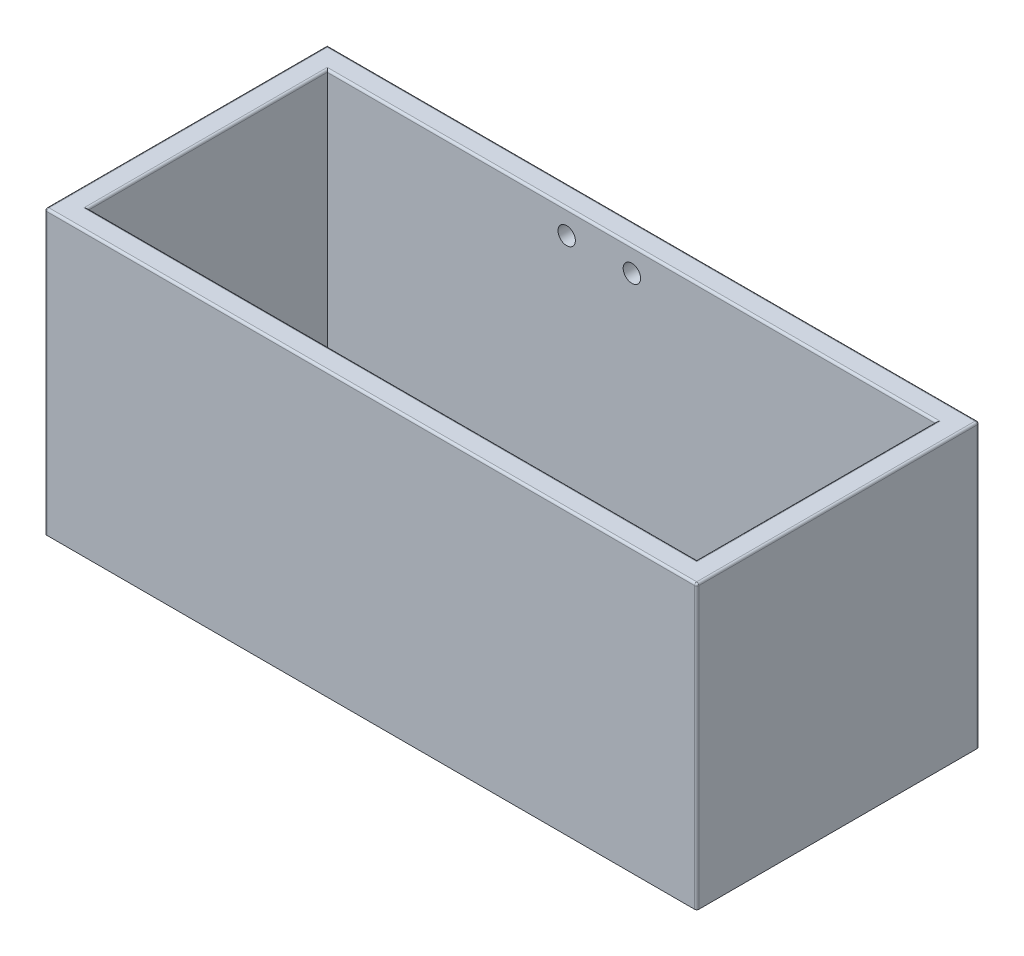
ISO-10303-21;
HEADER;
FILE_DESCRIPTION(('STEP AP214'),'2;1');
FILE_NAME('part.step','',(''),(''),'','','');
FILE_SCHEMA(('AUTOMOTIVE_DESIGN { 1 0 10303 214 1 1 1 1 }'));
ENDSEC;
DATA;
#1=APPLICATION_CONTEXT('core data for automotive mechanical design processes');
#2=APPLICATION_PROTOCOL_DEFINITION('international standard','automotive_design',2000,#1);
#3=PRODUCT_CONTEXT('',#1,'mechanical');
#4=PRODUCT('Part','Part','',(#3));
#5=PRODUCT_RELATED_PRODUCT_CATEGORY('part','',(#4));
#6=PRODUCT_DEFINITION_FORMATION('','',#4);
#7=PRODUCT_DEFINITION_CONTEXT('part definition',#1,'design');
#8=PRODUCT_DEFINITION('design','',#6,#7);
#9=PRODUCT_DEFINITION_SHAPE('','',#8);
#10=(LENGTH_UNIT() NAMED_UNIT(*) SI_UNIT(.MILLI.,.METRE.));
#11=(NAMED_UNIT(*) PLANE_ANGLE_UNIT() SI_UNIT($,.RADIAN.));
#12=(NAMED_UNIT(*) SI_UNIT($,.STERADIAN.) SOLID_ANGLE_UNIT());
#13=UNCERTAINTY_MEASURE_WITH_UNIT(LENGTH_MEASURE(1.E-05),#10,'distance_accuracy_value','');
#14=(GEOMETRIC_REPRESENTATION_CONTEXT(3) GLOBAL_UNCERTAINTY_ASSIGNED_CONTEXT((#13)) GLOBAL_UNIT_ASSIGNED_CONTEXT((#10,
#11,#12)) REPRESENTATION_CONTEXT('',''));
#15=CARTESIAN_POINT('',(0.,0.,0.));
#16=DIRECTION('',(0.,0.,1.));
#17=DIRECTION('',(1.,0.,0.));
#18=AXIS2_PLACEMENT_3D('',#15,#16,#17);
#19=CARTESIAN_POINT('',(-114.282418976587,130.,130.));
#20=DIRECTION('',(1.,0.,0.));
#21=DIRECTION('',(0.,0.,-1.));
#22=AXIS2_PLACEMENT_3D('',#19,#20,#21);
#23=PLANE('',#22);
#24=DIRECTION('',(0.,0.,-1.));
#25=VECTOR('',#24,1.);
#26=CARTESIAN_POINT('',(-114.282418976587,0.,130.));
#27=LINE('',#26,#25);
#28=CARTESIAN_POINT('',(-114.282418976587,0.,129.));
#29=VERTEX_POINT('',#28);
#30=CARTESIAN_POINT('',(-114.282418976587,0.,0.));
#31=VERTEX_POINT('',#30);
#32=EDGE_CURVE('E200',#29,#31,#27,.T.);
#33=ORIENTED_EDGE('',*,*,#32,.F.);
#34=DIRECTION('',(0.,-1.,0.));
#35=VECTOR('',#34,1.);
#36=CARTESIAN_POINT('',(-114.282418976587,129.,129.));
#37=LINE('',#36,#35);
#38=CARTESIAN_POINT('',(-114.282418976587,129.,129.));
#39=VERTEX_POINT('',#38);
#40=EDGE_CURVE('E247',#29,#39,#37,.F.);
#41=ORIENTED_EDGE('',*,*,#40,.T.);
#42=DIRECTION('',(0.,0.,-1.));
#43=VECTOR('',#42,1.);
#44=CARTESIAN_POINT('',(-114.282418976587,129.,130.));
#45=LINE('',#44,#43);
#46=CARTESIAN_POINT('',(-114.282418976587,129.,0.));
#47=VERTEX_POINT('',#46);
#48=EDGE_CURVE('E228',#39,#47,#45,.T.);
#49=ORIENTED_EDGE('',*,*,#48,.T.);
#50=DIRECTION('',(0.,-1.,0.));
#51=VECTOR('',#50,1.);
#52=CARTESIAN_POINT('',(-114.282418976587,130.,0.));
#53=LINE('',#52,#51);
#54=EDGE_CURVE('E184',#47,#31,#53,.T.);
#55=ORIENTED_EDGE('',*,*,#54,.T.);
#56=EDGE_LOOP('',(#33,#41,#49,#55));
#57=FACE_BOUND('',#56,.T.);
#58=ADVANCED_FACE('F37',(#57),#23,.F.);
#59=CARTESIAN_POINT('',(-114.282418976587,0.,130.));
#60=DIRECTION('',(0.,1.,0.));
#61=DIRECTION('',(0.,0.,1.));
#62=AXIS2_PLACEMENT_3D('',#59,#60,#61);
#63=PLANE('',#62);
#64=DIRECTION('',(0.,0.,-1.));
#65=VECTOR('',#64,1.);
#66=CARTESIAN_POINT('',(185.717581023413,0.,130.));
#67=LINE('',#66,#65);
#68=CARTESIAN_POINT('',(185.717581023413,0.,129.));
#69=VERTEX_POINT('',#68);
#70=CARTESIAN_POINT('',(185.717581023413,0.,1.));
#71=VERTEX_POINT('',#70);
#72=EDGE_CURVE('E192',#69,#71,#67,.T.);
#73=ORIENTED_EDGE('',*,*,#72,.F.);
#74=CARTESIAN_POINT('',(184.717581023413,0.,129.));
#75=DIRECTION('',(0.,1.,0.));
#76=DIRECTION('',(0.,0.,1.));
#77=AXIS2_PLACEMENT_3D('',#74,#75,#76);
#78=CIRCLE('',#77,1.);
#79=CARTESIAN_POINT('',(184.717581023413,0.,130.));
#80=VERTEX_POINT('',#79);
#81=EDGE_CURVE('E269',#69,#80,#78,.F.);
#82=ORIENTED_EDGE('',*,*,#81,.T.);
#83=DIRECTION('',(1.,0.,0.));
#84=VECTOR('',#83,1.);
#85=CARTESIAN_POINT('',(-114.282418976587,0.,130.));
#86=LINE('',#85,#84);
#87=CARTESIAN_POINT('',(-113.282418976587,0.,130.));
#88=VERTEX_POINT('',#87);
#89=EDGE_CURVE('E189',#88,#80,#86,.T.);
#90=ORIENTED_EDGE('',*,*,#89,.F.);
#91=CARTESIAN_POINT('',(-113.282418976587,0.,129.));
#92=DIRECTION('',(0.,1.,0.));
#93=DIRECTION('',(0.,0.,1.));
#94=AXIS2_PLACEMENT_3D('',#91,#92,#93);
#95=CIRCLE('',#94,1.);
#96=EDGE_CURVE('E245',#88,#29,#95,.F.);
#97=ORIENTED_EDGE('',*,*,#96,.T.);
#98=ORIENTED_EDGE('',*,*,#32,.T.);
#99=DIRECTION('',(1.,0.,0.));
#100=VECTOR('',#99,1.);
#101=CARTESIAN_POINT('',(-114.282418976587,0.,0.));
#102=LINE('',#101,#100);
#103=CARTESIAN_POINT('',(184.717581023413,0.,0.));
#104=VERTEX_POINT('',#103);
#105=EDGE_CURVE('E193',#31,#104,#102,.T.);
#106=ORIENTED_EDGE('',*,*,#105,.T.);
#107=CARTESIAN_POINT('',(184.717581023413,0.,1.));
#108=DIRECTION('',(0.,1.,0.));
#109=DIRECTION('',(0.,0.,1.));
#110=AXIS2_PLACEMENT_3D('',#107,#108,#109);
#111=CIRCLE('',#110,1.);
#112=EDGE_CURVE('E267',#104,#71,#111,.F.);
#113=ORIENTED_EDGE('',*,*,#112,.T.);
#114=EDGE_LOOP('',(#73,#82,#90,#97,#98,#106,#113));
#115=FACE_BOUND('',#114,.T.);
#116=ADVANCED_FACE('F300',(#115),#63,.F.);
#117=CARTESIAN_POINT('',(185.717581023413,0.,130.));
#118=DIRECTION('',(-1.,0.,0.));
#119=DIRECTION('',(0.,-1.,0.));
#120=AXIS2_PLACEMENT_3D('',#117,#118,#119);
#121=PLANE('',#120);
#122=DIRECTION('',(0.,0.,-1.));
#123=VECTOR('',#122,1.);
#124=CARTESIAN_POINT('',(185.717581023413,129.,130.));
#125=LINE('',#124,#123);
#126=CARTESIAN_POINT('',(185.717581023413,129.,1.));
#127=VERTEX_POINT('',#126);
#128=CARTESIAN_POINT('',(185.717581023413,129.,129.));
#129=VERTEX_POINT('',#128);
#130=EDGE_CURVE('E261',#127,#129,#125,.F.);
#131=ORIENTED_EDGE('',*,*,#130,.T.);
#132=DIRECTION('',(0.,1.,0.));
#133=VECTOR('',#132,1.);
#134=CARTESIAN_POINT('',(185.717581023413,0.,129.));
#135=LINE('',#134,#133);
#136=EDGE_CURVE('E265',#129,#69,#135,.F.);
#137=ORIENTED_EDGE('',*,*,#136,.T.);
#138=ORIENTED_EDGE('',*,*,#72,.T.);
#139=DIRECTION('',(0.,1.,0.));
#140=VECTOR('',#139,1.);
#141=CARTESIAN_POINT('',(185.717581023413,0.,1.));
#142=LINE('',#141,#140);
#143=EDGE_CURVE('E263',#71,#127,#142,.T.);
#144=ORIENTED_EDGE('',*,*,#143,.T.);
#145=EDGE_LOOP('',(#131,#137,#138,#144));
#146=FACE_BOUND('',#145,.T.);
#147=ADVANCED_FACE('F330',(#146),#121,.F.);
#148=CARTESIAN_POINT('',(185.717581023413,130.,130.));
#149=DIRECTION('',(0.,-1.,0.));
#150=DIRECTION('',(1.,0.,0.));
#151=AXIS2_PLACEMENT_3D('',#148,#149,#150);
#152=PLANE('',#151);
#153=DIRECTION('',(-1.,0.,0.));
#154=VECTOR('',#153,1.);
#155=CARTESIAN_POINT('',(185.717581023413,130.,9.00000000000001));
#156=LINE('',#155,#154);
#157=CARTESIAN_POINT('',(-105.282418976587,130.,9.));
#158=VERTEX_POINT('',#157);
#159=CARTESIAN_POINT('',(176.717581023413,130.,9.00000000000001));
#160=VERTEX_POINT('',#159);
#161=EDGE_CURVE('E207',#158,#160,#156,.F.);
#162=ORIENTED_EDGE('',*,*,#161,.T.);
#163=DIRECTION('',(0.,0.,-1.));
#164=VECTOR('',#163,1.);
#165=CARTESIAN_POINT('',(176.717581023413,130.,130.));
#166=LINE('',#165,#164);
#167=CARTESIAN_POINT('',(176.717581023413,130.,121.));
#168=VERTEX_POINT('',#167);
#169=EDGE_CURVE('E220',#160,#168,#166,.F.);
#170=ORIENTED_EDGE('',*,*,#169,.T.);
#171=DIRECTION('',(1.,0.,0.));
#172=VECTOR('',#171,1.);
#173=CARTESIAN_POINT('',(185.717581023413,130.,121.));
#174=LINE('',#173,#172);
#175=CARTESIAN_POINT('',(-105.282418976587,130.,121.));
#176=VERTEX_POINT('',#175);
#177=EDGE_CURVE('E212',#168,#176,#174,.F.);
#178=ORIENTED_EDGE('',*,*,#177,.T.);
#179=DIRECTION('',(0.,0.,1.));
#180=VECTOR('',#179,1.);
#181=CARTESIAN_POINT('',(-105.282418976587,130.,130.));
#182=LINE('',#181,#180);
#183=EDGE_CURVE('E205',#176,#158,#182,.F.);
#184=ORIENTED_EDGE('',*,*,#183,.T.);
#185=EDGE_LOOP('',(#162,#170,#178,#184));
#186=FACE_BOUND('',#185,.T.);
#187=DIRECTION('',(-1.,0.,0.));
#188=VECTOR('',#187,1.);
#189=CARTESIAN_POINT('',(185.717581023413,130.,129.));
#190=LINE('',#189,#188);
#191=CARTESIAN_POINT('',(-113.282418976587,130.,129.));
#192=VERTEX_POINT('',#191);
#193=CARTESIAN_POINT('',(184.717581023413,130.,129.));
#194=VERTEX_POINT('',#193);
#195=EDGE_CURVE('E251',#192,#194,#190,.F.);
#196=ORIENTED_EDGE('',*,*,#195,.T.);
#197=DIRECTION('',(0.,0.,-1.));
#198=VECTOR('',#197,1.);
#199=CARTESIAN_POINT('',(184.717581023413,130.,130.));
#200=LINE('',#199,#198);
#201=CARTESIAN_POINT('',(184.717581023413,130.,1.));
#202=VERTEX_POINT('',#201);
#203=EDGE_CURVE('E11',#194,#202,#200,.T.);
#204=ORIENTED_EDGE('',*,*,#203,.T.);
#205=DIRECTION('',(-1.,0.,0.));
#206=VECTOR('',#205,1.);
#207=CARTESIAN_POINT('',(185.717581023413,130.,1.));
#208=LINE('',#207,#206);
#209=CARTESIAN_POINT('',(-113.282418976587,130.,1.));
#210=VERTEX_POINT('',#209);
#211=EDGE_CURVE('E230',#202,#210,#208,.T.);
#212=ORIENTED_EDGE('',*,*,#211,.T.);
#213=DIRECTION('',(0.,0.,-1.));
#214=VECTOR('',#213,1.);
#215=CARTESIAN_POINT('',(-113.282418976587,130.,130.));
#216=LINE('',#215,#214);
#217=EDGE_CURVE('E232',#210,#192,#216,.F.);
#218=ORIENTED_EDGE('',*,*,#217,.T.);
#219=EDGE_LOOP('',(#196,#204,#212,#218));
#220=FACE_BOUND('',#219,.T.);
#221=ADVANCED_FACE('F350',(#186,#220),#152,.F.);
#222=CARTESIAN_POINT('',(0.,0.,130.));
#223=DIRECTION('',(0.,0.,1.));
#224=DIRECTION('',(1.,0.,0.));
#225=AXIS2_PLACEMENT_3D('',#222,#223,#224);
#226=PLANE('',#225);
#227=ORIENTED_EDGE('',*,*,#89,.T.);
#228=DIRECTION('',(0.,1.,0.));
#229=VECTOR('',#228,1.);
#230=CARTESIAN_POINT('',(184.717581023413,129.,130.));
#231=LINE('',#230,#229);
#232=CARTESIAN_POINT('',(184.717581023413,129.,130.));
#233=VERTEX_POINT('',#232);
#234=EDGE_CURVE('E253',#80,#233,#231,.T.);
#235=ORIENTED_EDGE('',*,*,#234,.T.);
#236=DIRECTION('',(-1.,0.,0.));
#237=VECTOR('',#236,1.);
#238=CARTESIAN_POINT('',(-113.282418976587,129.,130.));
#239=LINE('',#238,#237);
#240=CARTESIAN_POINT('',(-113.282418976587,129.,130.));
#241=VERTEX_POINT('',#240);
#242=EDGE_CURVE('E237',#233,#241,#239,.T.);
#243=ORIENTED_EDGE('',*,*,#242,.T.);
#244=DIRECTION('',(0.,-1.,0.));
#245=VECTOR('',#244,1.);
#246=CARTESIAN_POINT('',(-113.282418976587,0.,130.));
#247=LINE('',#246,#245);
#248=EDGE_CURVE('E242',#241,#88,#247,.T.);
#249=ORIENTED_EDGE('',*,*,#248,.T.);
#250=EDGE_LOOP('',(#227,#235,#243,#249));
#251=FACE_BOUND('',#250,.T.);
#252=ADVANCED_FACE('F375',(#251),#226,.T.);
#253=CARTESIAN_POINT('',(0.,0.,0.));
#254=DIRECTION('',(0.,0.,1.));
#255=DIRECTION('',(1.,0.,0.));
#256=AXIS2_PLACEMENT_3D('',#253,#254,#255);
#257=PLANE('',#256);
#258=CARTESIAN_POINT('',(35.8724753435465,119.001199684483,0.));
#259=DIRECTION('',(0.,0.,1.));
#260=DIRECTION('',(1.,0.,0.));
#261=AXIS2_PLACEMENT_3D('',#258,#259,#260);
#262=CIRCLE('',#261,4.00000000000001);
#263=CARTESIAN_POINT('',(39.8724753435465,119.001199684483,0.));
#264=VERTEX_POINT('',#263);
#265=EDGE_CURVE('E590',#264,#264,#262,.T.);
#266=ORIENTED_EDGE('',*,*,#265,.T.);
#267=EDGE_LOOP('',(#266));
#268=FACE_BOUND('',#267,.T.);
#269=CARTESIAN_POINT('',(5.87247536753392,119.,0.));
#270=DIRECTION('',(0.,0.,1.));
#271=DIRECTION('',(1.,0.,0.));
#272=AXIS2_PLACEMENT_3D('',#269,#270,#271);
#273=CIRCLE('',#272,4.);
#274=CARTESIAN_POINT('',(9.87247536753392,119.,0.));
#275=VERTEX_POINT('',#274);
#276=EDGE_CURVE('E279',#275,#275,#273,.T.);
#277=ORIENTED_EDGE('',*,*,#276,.T.);
#278=EDGE_LOOP('',(#277));
#279=FACE_BOUND('',#278,.T.);
#280=DIRECTION('',(-1.,0.,0.));
#281=VECTOR('',#280,1.);
#282=CARTESIAN_POINT('',(0.,129.,0.));
#283=LINE('',#282,#281);
#284=CARTESIAN_POINT('',(184.717581023413,129.,0.));
#285=VERTEX_POINT('',#284);
#286=EDGE_CURVE('E235',#47,#285,#283,.F.);
#287=ORIENTED_EDGE('',*,*,#286,.T.);
#288=DIRECTION('',(0.,1.,0.));
#289=VECTOR('',#288,1.);
#290=CARTESIAN_POINT('',(184.717581023413,0.,0.));
#291=LINE('',#290,#289);
#292=EDGE_CURVE('E273',#285,#104,#291,.F.);
#293=ORIENTED_EDGE('',*,*,#292,.T.);
#294=ORIENTED_EDGE('',*,*,#105,.F.);
#295=ORIENTED_EDGE('',*,*,#54,.F.);
#296=EDGE_LOOP('',(#287,#293,#294,#295));
#297=FACE_BOUND('',#296,.T.);
#298=ADVANCED_FACE('F296',(#268,#279,#297),#257,.F.);
#299=CARTESIAN_POINT('',(-104.282418976587,10.,10.));
#300=DIRECTION('',(-1.,0.,0.));
#301=DIRECTION('',(0.,-1.,0.));
#302=AXIS2_PLACEMENT_3D('',#299,#300,#301);
#303=PLANE('',#302);
#304=DIRECTION('',(0.,1.,0.));
#305=VECTOR('',#304,1.);
#306=CARTESIAN_POINT('',(-104.282418976587,10.,10.));
#307=LINE('',#306,#305);
#308=CARTESIAN_POINT('',(-104.282418976587,10.,10.));
#309=VERTEX_POINT('',#308);
#310=CARTESIAN_POINT('',(-104.282418976587,129.,10.));
#311=VERTEX_POINT('',#310);
#312=EDGE_CURVE('E182',#309,#311,#307,.T.);
#313=ORIENTED_EDGE('',*,*,#312,.T.);
#314=DIRECTION('',(0.,0.,1.));
#315=VECTOR('',#314,1.);
#316=CARTESIAN_POINT('',(-104.282418976587,129.,10.));
#317=LINE('',#316,#315);
#318=CARTESIAN_POINT('',(-104.282418976587,129.,120.));
#319=VERTEX_POINT('',#318);
#320=EDGE_CURVE('E154',#311,#319,#317,.T.);
#321=ORIENTED_EDGE('',*,*,#320,.T.);
#322=DIRECTION('',(0.,1.,0.));
#323=VECTOR('',#322,1.);
#324=CARTESIAN_POINT('',(-104.282418976587,10.,120.));
#325=LINE('',#324,#323);
#326=CARTESIAN_POINT('',(-104.282418976587,10.,120.));
#327=VERTEX_POINT('',#326);
#328=EDGE_CURVE('E146',#327,#319,#325,.T.);
#329=ORIENTED_EDGE('',*,*,#328,.F.);
#330=DIRECTION('',(0.,0.,1.));
#331=VECTOR('',#330,1.);
#332=CARTESIAN_POINT('',(-104.282418976587,10.,10.));
#333=LINE('',#332,#331);
#334=EDGE_CURVE('E151',#309,#327,#333,.T.);
#335=ORIENTED_EDGE('',*,*,#334,.F.);
#336=EDGE_LOOP('',(#313,#321,#329,#335));
#337=FACE_BOUND('',#336,.T.);
#338=ADVANCED_FACE('F149',(#337),#303,.F.);
#339=CARTESIAN_POINT('',(-104.282418976587,10.,10.));
#340=DIRECTION('',(0.,0.,-1.));
#341=DIRECTION('',(-1.,0.,0.));
#342=AXIS2_PLACEMENT_3D('',#339,#340,#341);
#343=PLANE('',#342);
#344=CARTESIAN_POINT('',(35.8724753435465,119.001199684483,10.));
#345=DIRECTION('',(0.,0.,1.));
#346=DIRECTION('',(1.,0.,0.));
#347=AXIS2_PLACEMENT_3D('',#344,#345,#346);
#348=CIRCLE('',#347,4.00000000000001);
#349=CARTESIAN_POINT('',(39.8724753435465,119.001199684483,10.));
#350=VERTEX_POINT('',#349);
#351=EDGE_CURVE('E592',#350,#350,#348,.T.);
#352=ORIENTED_EDGE('',*,*,#351,.F.);
#353=EDGE_LOOP('',(#352));
#354=FACE_BOUND('',#353,.T.);
#355=CARTESIAN_POINT('',(5.87247536753392,119.,10.));
#356=DIRECTION('',(0.,0.,1.));
#357=DIRECTION('',(1.,0.,0.));
#358=AXIS2_PLACEMENT_3D('',#355,#356,#357);
#359=CIRCLE('',#358,4.);
#360=CARTESIAN_POINT('',(9.87247536753392,119.,10.));
#361=VERTEX_POINT('',#360);
#362=EDGE_CURVE('E177',#361,#361,#359,.T.);
#363=ORIENTED_EDGE('',*,*,#362,.F.);
#364=EDGE_LOOP('',(#363));
#365=FACE_BOUND('',#364,.T.);
#366=DIRECTION('',(0.,1.,0.));
#367=VECTOR('',#366,1.);
#368=CARTESIAN_POINT('',(175.717581023413,10.0000000000001,10.));
#369=LINE('',#368,#367);
#370=CARTESIAN_POINT('',(175.717581023413,10.0000000000001,10.));
#371=VERTEX_POINT('',#370);
#372=CARTESIAN_POINT('',(175.717581023413,129.,10.));
#373=VERTEX_POINT('',#372);
#374=EDGE_CURVE('E185',#371,#373,#369,.T.);
#375=ORIENTED_EDGE('',*,*,#374,.T.);
#376=DIRECTION('',(-1.,0.,0.));
#377=VECTOR('',#376,1.);
#378=CARTESIAN_POINT('',(-104.282418976587,129.,10.));
#379=LINE('',#378,#377);
#380=EDGE_CURVE('E202',#373,#311,#379,.T.);
#381=ORIENTED_EDGE('',*,*,#380,.T.);
#382=ORIENTED_EDGE('',*,*,#312,.F.);
#383=DIRECTION('',(-1.,0.,0.));
#384=VECTOR('',#383,1.);
#385=CARTESIAN_POINT('',(-104.282418976587,10.,10.));
#386=LINE('',#385,#384);
#387=EDGE_CURVE('E159',#371,#309,#386,.T.);
#388=ORIENTED_EDGE('',*,*,#387,.F.);
#389=EDGE_LOOP('',(#375,#381,#382,#388));
#390=FACE_BOUND('',#389,.T.);
#391=ADVANCED_FACE('F357',(#354,#365,#390),#343,.F.);
#392=CARTESIAN_POINT('',(175.717581023413,10.0000000000001,10.));
#393=DIRECTION('',(1.,0.,0.));
#394=DIRECTION('',(0.,0.,-1.));
#395=AXIS2_PLACEMENT_3D('',#392,#393,#394);
#396=PLANE('',#395);
#397=DIRECTION('',(0.,1.,0.));
#398=VECTOR('',#397,1.);
#399=CARTESIAN_POINT('',(175.717581023413,10.0000000000001,120.));
#400=LINE('',#399,#398);
#401=CARTESIAN_POINT('',(175.717581023413,10.0000000000001,120.));
#402=VERTEX_POINT('',#401);
#403=CARTESIAN_POINT('',(175.717581023413,129.,120.));
#404=VERTEX_POINT('',#403);
#405=EDGE_CURVE('E158',#402,#404,#400,.T.);
#406=ORIENTED_EDGE('',*,*,#405,.T.);
#407=DIRECTION('',(0.,0.,-1.));
#408=VECTOR('',#407,1.);
#409=CARTESIAN_POINT('',(175.717581023413,129.,10.));
#410=LINE('',#409,#408);
#411=EDGE_CURVE('E217',#404,#373,#410,.T.);
#412=ORIENTED_EDGE('',*,*,#411,.T.);
#413=ORIENTED_EDGE('',*,*,#374,.F.);
#414=DIRECTION('',(0.,0.,-1.));
#415=VECTOR('',#414,1.);
#416=CARTESIAN_POINT('',(175.717581023413,10.0000000000001,10.));
#417=LINE('',#416,#415);
#418=EDGE_CURVE('E168',#402,#371,#417,.T.);
#419=ORIENTED_EDGE('',*,*,#418,.F.);
#420=EDGE_LOOP('',(#406,#412,#413,#419));
#421=FACE_BOUND('',#420,.T.);
#422=ADVANCED_FACE('F355',(#421),#396,.F.);
#423=CARTESIAN_POINT('',(-104.282418976587,10.,120.));
#424=DIRECTION('',(0.,0.,1.));
#425=DIRECTION('',(1.,0.,0.));
#426=AXIS2_PLACEMENT_3D('',#423,#424,#425);
#427=PLANE('',#426);
#428=ORIENTED_EDGE('',*,*,#328,.T.);
#429=DIRECTION('',(1.,0.,0.));
#430=VECTOR('',#429,1.);
#431=CARTESIAN_POINT('',(-104.282418976587,129.,120.));
#432=LINE('',#431,#430);
#433=EDGE_CURVE('E209',#319,#404,#432,.T.);
#434=ORIENTED_EDGE('',*,*,#433,.T.);
#435=ORIENTED_EDGE('',*,*,#405,.F.);
#436=DIRECTION('',(1.,0.,0.));
#437=VECTOR('',#436,1.);
#438=CARTESIAN_POINT('',(-104.282418976587,10.,120.));
#439=LINE('',#438,#437);
#440=EDGE_CURVE('E162',#327,#402,#439,.T.);
#441=ORIENTED_EDGE('',*,*,#440,.F.);
#442=EDGE_LOOP('',(#428,#434,#435,#441));
#443=FACE_BOUND('',#442,.T.);
#444=ADVANCED_FACE('F163',(#443),#427,.F.);
#445=CARTESIAN_POINT('',(0.,10.,0.));
#446=DIRECTION('',(0.,1.,0.));
#447=DIRECTION('',(-1.,0.,0.));
#448=AXIS2_PLACEMENT_3D('',#445,#446,#447);
#449=PLANE('',#448);
#450=ORIENTED_EDGE('',*,*,#334,.T.);
#451=ORIENTED_EDGE('',*,*,#440,.T.);
#452=ORIENTED_EDGE('',*,*,#418,.T.);
#453=ORIENTED_EDGE('',*,*,#387,.T.);
#454=EDGE_LOOP('',(#450,#451,#452,#453));
#455=FACE_BOUND('',#454,.T.);
#456=ADVANCED_FACE('F170',(#455),#449,.T.);
#457=CARTESIAN_POINT('',(-105.282418976587,129.,10.));
#458=DIRECTION('',(0.,0.,1.));
#459=DIRECTION('',(1.,0.,0.));
#460=AXIS2_PLACEMENT_3D('',#457,#458,#459);
#461=CYLINDRICAL_SURFACE('',#460,1.);
#462=ORIENTED_EDGE('',*,*,#183,.F.);
#463=CARTESIAN_POINT('',(-105.282418976587,129.,121.));
#464=DIRECTION('',(0.707106781186548,0.,0.707106781186547));
#465=DIRECTION('',(0.707106781186547,0.,-0.707106781186548));
#466=AXIS2_PLACEMENT_3D('',#463,#464,#465);
#467=ELLIPSE('',#466,1.41421356237309,1.);
#468=EDGE_CURVE('E215',#176,#319,#467,.F.);
#469=ORIENTED_EDGE('',*,*,#468,.T.);
#470=ORIENTED_EDGE('',*,*,#320,.F.);
#471=CARTESIAN_POINT('',(-105.282418976587,129.,9.));
#472=DIRECTION('',(-0.707106781186547,0.,0.707106781186548));
#473=DIRECTION('',(-0.707106781186548,0.,-0.707106781186547));
#474=AXIS2_PLACEMENT_3D('',#471,#472,#473);
#475=ELLIPSE('',#474,1.4142135623731,1.);
#476=EDGE_CURVE('E172',#158,#311,#475,.F.);
#477=ORIENTED_EDGE('',*,*,#476,.F.);
#478=EDGE_LOOP('',(#462,#469,#470,#477));
#479=FACE_BOUND('',#478,.T.);
#480=ADVANCED_FACE('F337',(#479),#461,.T.);
#481=CARTESIAN_POINT('',(-104.282418976587,129.,9.));
#482=DIRECTION('',(-1.,0.,0.));
#483=DIRECTION('',(0.,-1.,0.));
#484=AXIS2_PLACEMENT_3D('',#481,#482,#483);
#485=CYLINDRICAL_SURFACE('',#484,1.);
#486=ORIENTED_EDGE('',*,*,#380,.F.);
#487=CARTESIAN_POINT('',(176.717581023413,129.,9.));
#488=DIRECTION('',(-0.707106781186548,0.,-0.707106781186547));
#489=DIRECTION('',(0.707106781186547,0.,-0.707106781186548));
#490=AXIS2_PLACEMENT_3D('',#487,#488,#489);
#491=ELLIPSE('',#490,1.41421356237309,1.);
#492=EDGE_CURVE('E223',#373,#160,#491,.T.);
#493=ORIENTED_EDGE('',*,*,#492,.T.);
#494=ORIENTED_EDGE('',*,*,#161,.F.);
#495=ORIENTED_EDGE('',*,*,#476,.T.);
#496=EDGE_LOOP('',(#486,#493,#494,#495));
#497=FACE_BOUND('',#496,.T.);
#498=ADVANCED_FACE('F334',(#497),#485,.T.);
#499=CARTESIAN_POINT('',(-104.282418976587,129.,121.));
#500=DIRECTION('',(1.,0.,0.));
#501=DIRECTION('',(0.,1.,0.));
#502=AXIS2_PLACEMENT_3D('',#499,#500,#501);
#503=CYLINDRICAL_SURFACE('',#502,1.);
#504=ORIENTED_EDGE('',*,*,#468,.F.);
#505=ORIENTED_EDGE('',*,*,#177,.F.);
#506=CARTESIAN_POINT('',(176.717581023413,129.,121.));
#507=DIRECTION('',(0.707106781186547,0.,-0.707106781186548));
#508=DIRECTION('',(-0.707106781186548,0.,-0.707106781186547));
#509=AXIS2_PLACEMENT_3D('',#506,#507,#508);
#510=ELLIPSE('',#509,1.4142135623731,1.);
#511=EDGE_CURVE('E226',#168,#404,#510,.F.);
#512=ORIENTED_EDGE('',*,*,#511,.T.);
#513=ORIENTED_EDGE('',*,*,#433,.F.);
#514=EDGE_LOOP('',(#504,#505,#512,#513));
#515=FACE_BOUND('',#514,.T.);
#516=ADVANCED_FACE('F321',(#515),#503,.T.);
#517=CARTESIAN_POINT('',(176.717581023413,129.,10.));
#518=DIRECTION('',(0.,0.,-1.));
#519=DIRECTION('',(-1.,0.,0.));
#520=AXIS2_PLACEMENT_3D('',#517,#518,#519);
#521=CYLINDRICAL_SURFACE('',#520,1.);
#522=ORIENTED_EDGE('',*,*,#511,.F.);
#523=ORIENTED_EDGE('',*,*,#169,.F.);
#524=ORIENTED_EDGE('',*,*,#492,.F.);
#525=ORIENTED_EDGE('',*,*,#411,.F.);
#526=EDGE_LOOP('',(#522,#523,#524,#525));
#527=FACE_BOUND('',#526,.T.);
#528=ADVANCED_FACE('F313',(#527),#521,.T.);
#529=CARTESIAN_POINT('',(185.717581023413,129.,1.));
#530=DIRECTION('',(-1.,0.,0.));
#531=DIRECTION('',(0.,-1.,0.));
#532=AXIS2_PLACEMENT_3D('',#529,#530,#531);
#533=CYLINDRICAL_SURFACE('',#532,1.);
#534=ORIENTED_EDGE('',*,*,#211,.F.);
#535=CARTESIAN_POINT('',(184.717581023413,129.,1.));
#536=DIRECTION('',(-1.,0.,0.));
#537=DIRECTION('',(0.,-1.,0.));
#538=AXIS2_PLACEMENT_3D('',#535,#536,#537);
#539=CIRCLE('',#538,1.);
#540=EDGE_CURVE('E46',#202,#285,#539,.T.);
#541=ORIENTED_EDGE('',*,*,#540,.T.);
#542=ORIENTED_EDGE('',*,*,#286,.F.);
#543=CARTESIAN_POINT('',(-113.282418976587,129.,1.));
#544=DIRECTION('',(-0.707106781186547,0.,0.707106781186547));
#545=DIRECTION('',(-0.707106781186547,0.,-0.707106781186547));
#546=AXIS2_PLACEMENT_3D('',#543,#544,#545);
#547=ELLIPSE('',#546,1.41421356237309,1.);
#548=EDGE_CURVE('E174',#210,#47,#547,.T.);
#549=ORIENTED_EDGE('',*,*,#548,.F.);
#550=EDGE_LOOP('',(#534,#541,#542,#549));
#551=FACE_BOUND('',#550,.T.);
#552=ADVANCED_FACE('F311',(#551),#533,.T.);
#553=CARTESIAN_POINT('',(-113.282418976587,129.,130.));
#554=DIRECTION('',(0.,0.,-1.));
#555=DIRECTION('',(-1.,0.,0.));
#556=AXIS2_PLACEMENT_3D('',#553,#554,#555);
#557=CYLINDRICAL_SURFACE('',#556,1.);
#558=ORIENTED_EDGE('',*,*,#48,.F.);
#559=CARTESIAN_POINT('',(-113.282418976587,129.,129.));
#560=DIRECTION('',(0.,0.,-1.));
#561=DIRECTION('',(-1.,0.,0.));
#562=AXIS2_PLACEMENT_3D('',#559,#560,#561);
#563=CIRCLE('',#562,1.);
#564=EDGE_CURVE('E249',#39,#192,#563,.T.);
#565=ORIENTED_EDGE('',*,*,#564,.T.);
#566=ORIENTED_EDGE('',*,*,#217,.F.);
#567=ORIENTED_EDGE('',*,*,#548,.T.);
#568=EDGE_LOOP('',(#558,#565,#566,#567));
#569=FACE_BOUND('',#568,.T.);
#570=ADVANCED_FACE('F310',(#569),#557,.T.);
#571=CARTESIAN_POINT('',(0.,129.,129.));
#572=DIRECTION('',(1.,0.,0.));
#573=DIRECTION('',(0.,1.,0.));
#574=AXIS2_PLACEMENT_3D('',#571,#572,#573);
#575=CYLINDRICAL_SURFACE('',#574,1.);
#576=ORIENTED_EDGE('',*,*,#242,.F.);
#577=CARTESIAN_POINT('',(184.717581023413,129.,129.));
#578=DIRECTION('',(1.,0.,0.));
#579=DIRECTION('',(0.,1.,0.));
#580=AXIS2_PLACEMENT_3D('',#577,#578,#579);
#581=CIRCLE('',#580,1.);
#582=EDGE_CURVE('E271',#233,#194,#581,.F.);
#583=ORIENTED_EDGE('',*,*,#582,.T.);
#584=ORIENTED_EDGE('',*,*,#195,.F.);
#585=CARTESIAN_POINT('',(-113.282418976587,129.,129.));
#586=DIRECTION('',(-1.,0.,0.));
#587=DIRECTION('',(0.,0.,1.));
#588=AXIS2_PLACEMENT_3D('',#585,#586,#587);
#589=CIRCLE('',#588,1.);
#590=EDGE_CURVE('E240',#241,#192,#589,.T.);
#591=ORIENTED_EDGE('',*,*,#590,.F.);
#592=EDGE_LOOP('',(#576,#583,#584,#591));
#593=FACE_BOUND('',#592,.T.);
#594=ADVANCED_FACE('F319',(#593),#575,.T.);
#595=CARTESIAN_POINT('',(-113.282418976587,129.,129.));
#596=DIRECTION('',(0.,0.,1.));
#597=DIRECTION('',(1.,0.,0.));
#598=AXIS2_PLACEMENT_3D('',#595,#596,#597);
#599=SPHERICAL_SURFACE('',#598,1.);
#600=ORIENTED_EDGE('',*,*,#590,.T.);
#601=ORIENTED_EDGE('',*,*,#564,.F.);
#602=CARTESIAN_POINT('',(-113.282418976587,129.,129.));
#603=DIRECTION('',(0.,-1.,0.));
#604=DIRECTION('',(0.,0.,-1.));
#605=AXIS2_PLACEMENT_3D('',#602,#603,#604);
#606=CIRCLE('',#605,1.);
#607=EDGE_CURVE('E254',#241,#39,#606,.T.);
#608=ORIENTED_EDGE('',*,*,#607,.F.);
#609=EDGE_LOOP('',(#600,#601,#608));
#610=FACE_BOUND('',#609,.T.);
#611=ADVANCED_FACE('F405',(#610),#599,.T.);
#612=CARTESIAN_POINT('',(-113.282418976587,0.,129.));
#613=DIRECTION('',(0.,1.,0.));
#614=DIRECTION('',(0.,0.,1.));
#615=AXIS2_PLACEMENT_3D('',#612,#613,#614);
#616=CYLINDRICAL_SURFACE('',#615,1.);
#617=ORIENTED_EDGE('',*,*,#607,.T.);
#618=ORIENTED_EDGE('',*,*,#40,.F.);
#619=ORIENTED_EDGE('',*,*,#96,.F.);
#620=ORIENTED_EDGE('',*,*,#248,.F.);
#621=EDGE_LOOP('',(#617,#618,#619,#620));
#622=FACE_BOUND('',#621,.T.);
#623=ADVANCED_FACE('F407',(#622),#616,.T.);
#624=CARTESIAN_POINT('',(184.717581023413,0.,1.));
#625=DIRECTION('',(0.,1.,0.));
#626=DIRECTION('',(-1.,0.,0.));
#627=AXIS2_PLACEMENT_3D('',#624,#625,#626);
#628=CYLINDRICAL_SURFACE('',#627,1.);
#629=ORIENTED_EDGE('',*,*,#112,.F.);
#630=ORIENTED_EDGE('',*,*,#292,.F.);
#631=CARTESIAN_POINT('',(184.717581023413,129.,1.));
#632=DIRECTION('',(0.,1.,0.));
#633=DIRECTION('',(0.,0.,1.));
#634=AXIS2_PLACEMENT_3D('',#631,#632,#633);
#635=CIRCLE('',#634,1.);
#636=EDGE_CURVE('E41',#127,#285,#635,.T.);
#637=ORIENTED_EDGE('',*,*,#636,.F.);
#638=ORIENTED_EDGE('',*,*,#143,.F.);
#639=EDGE_LOOP('',(#629,#630,#637,#638));
#640=FACE_BOUND('',#639,.T.);
#641=ADVANCED_FACE('F39',(#640),#628,.T.);
#642=CARTESIAN_POINT('',(184.717581023413,129.,1.));
#643=DIRECTION('',(-1.,0.,0.));
#644=DIRECTION('',(0.,-1.,0.));
#645=AXIS2_PLACEMENT_3D('',#642,#643,#644);
#646=SPHERICAL_SURFACE('',#645,1.);
#647=ORIENTED_EDGE('',*,*,#636,.T.);
#648=ORIENTED_EDGE('',*,*,#540,.F.);
#649=CARTESIAN_POINT('',(184.717581023413,129.,1.));
#650=DIRECTION('',(0.,0.,1.));
#651=DIRECTION('',(1.,0.,0.));
#652=AXIS2_PLACEMENT_3D('',#649,#650,#651);
#653=CIRCLE('',#652,1.);
#654=EDGE_CURVE('E281',#127,#202,#653,.T.);
#655=ORIENTED_EDGE('',*,*,#654,.F.);
#656=EDGE_LOOP('',(#647,#648,#655));
#657=FACE_BOUND('',#656,.T.);
#658=ADVANCED_FACE('F289',(#657),#646,.T.);
#659=CARTESIAN_POINT('',(184.717581023413,129.,130.));
#660=DIRECTION('',(0.,0.,-1.));
#661=DIRECTION('',(-1.,0.,0.));
#662=AXIS2_PLACEMENT_3D('',#659,#660,#661);
#663=CYLINDRICAL_SURFACE('',#662,1.);
#664=ORIENTED_EDGE('',*,*,#654,.T.);
#665=ORIENTED_EDGE('',*,*,#203,.F.);
#666=CARTESIAN_POINT('',(184.717581023413,129.,129.));
#667=DIRECTION('',(0.,0.,1.));
#668=DIRECTION('',(1.,0.,0.));
#669=AXIS2_PLACEMENT_3D('',#666,#667,#668);
#670=CIRCLE('',#669,1.);
#671=EDGE_CURVE('E278',#129,#194,#670,.T.);
#672=ORIENTED_EDGE('',*,*,#671,.F.);
#673=ORIENTED_EDGE('',*,*,#130,.F.);
#674=EDGE_LOOP('',(#664,#665,#672,#673));
#675=FACE_BOUND('',#674,.T.);
#676=ADVANCED_FACE('F389',(#675),#663,.T.);
#677=CARTESIAN_POINT('',(184.717581023413,129.,129.));
#678=DIRECTION('',(-1.,0.,0.));
#679=DIRECTION('',(0.,-1.,0.));
#680=AXIS2_PLACEMENT_3D('',#677,#678,#679);
#681=SPHERICAL_SURFACE('',#680,1.);
#682=ORIENTED_EDGE('',*,*,#671,.T.);
#683=ORIENTED_EDGE('',*,*,#582,.F.);
#684=CARTESIAN_POINT('',(184.717581023413,129.,129.));
#685=DIRECTION('',(0.,-1.,0.));
#686=DIRECTION('',(0.,0.,-1.));
#687=AXIS2_PLACEMENT_3D('',#684,#685,#686);
#688=CIRCLE('',#687,1.);
#689=EDGE_CURVE('E276',#129,#233,#688,.T.);
#690=ORIENTED_EDGE('',*,*,#689,.F.);
#691=EDGE_LOOP('',(#682,#683,#690));
#692=FACE_BOUND('',#691,.T.);
#693=ADVANCED_FACE('F397',(#692),#681,.T.);
#694=CARTESIAN_POINT('',(184.717581023413,0.,129.));
#695=DIRECTION('',(0.,-1.,0.));
#696=DIRECTION('',(1.,0.,0.));
#697=AXIS2_PLACEMENT_3D('',#694,#695,#696);
#698=CYLINDRICAL_SURFACE('',#697,1.);
#699=ORIENTED_EDGE('',*,*,#81,.F.);
#700=ORIENTED_EDGE('',*,*,#136,.F.);
#701=ORIENTED_EDGE('',*,*,#689,.T.);
#702=ORIENTED_EDGE('',*,*,#234,.F.);
#703=EDGE_LOOP('',(#699,#700,#701,#702));
#704=FACE_BOUND('',#703,.T.);
#705=ADVANCED_FACE('F395',(#704),#698,.T.);
#706=CARTESIAN_POINT('',(5.87247536753392,119.,0.));
#707=DIRECTION('',(0.,0.,1.));
#708=DIRECTION('',(1.,0.,0.));
#709=AXIS2_PLACEMENT_3D('',#706,#707,#708);
#710=CYLINDRICAL_SURFACE('',#709,4.);
#711=ORIENTED_EDGE('',*,*,#276,.F.);
#712=EDGE_LOOP('',(#711));
#713=FACE_BOUND('',#712,.T.);
#714=ORIENTED_EDGE('',*,*,#362,.T.);
#715=EDGE_LOOP('',(#714));
#716=FACE_BOUND('',#715,.T.);
#717=ADVANCED_FACE('F419',(#713,#716),#710,.F.);
#718=CARTESIAN_POINT('',(35.8724753435465,119.001199684483,0.));
#719=DIRECTION('',(0.,0.,1.));
#720=DIRECTION('',(1.,0.,0.));
#721=AXIS2_PLACEMENT_3D('',#718,#719,#720);
#722=CYLINDRICAL_SURFACE('',#721,4.00000000000001);
#723=ORIENTED_EDGE('',*,*,#265,.F.);
#724=EDGE_LOOP('',(#723));
#725=FACE_BOUND('',#724,.T.);
#726=ORIENTED_EDGE('',*,*,#351,.T.);
#727=EDGE_LOOP('',(#726));
#728=FACE_BOUND('',#727,.T.);
#729=ADVANCED_FACE('F447',(#725,#728),#722,.F.);
#730=CLOSED_SHELL('',(#58,#116,#147,#221,#252,#298,#338,#391,#422,#444,#456,#480,#498,#516,#528,
#552,#570,#594,#611,#623,#641,#658,#676,#693,#705,#717,#729));
#731=MANIFOLD_SOLID_BREP('B2',#730);
#732=ADVANCED_BREP_SHAPE_REPRESENTATION('',(#18,#731),#14);
#733=SHAPE_DEFINITION_REPRESENTATION(#9,#732);
ENDSEC;
END-ISO-10303-21;
